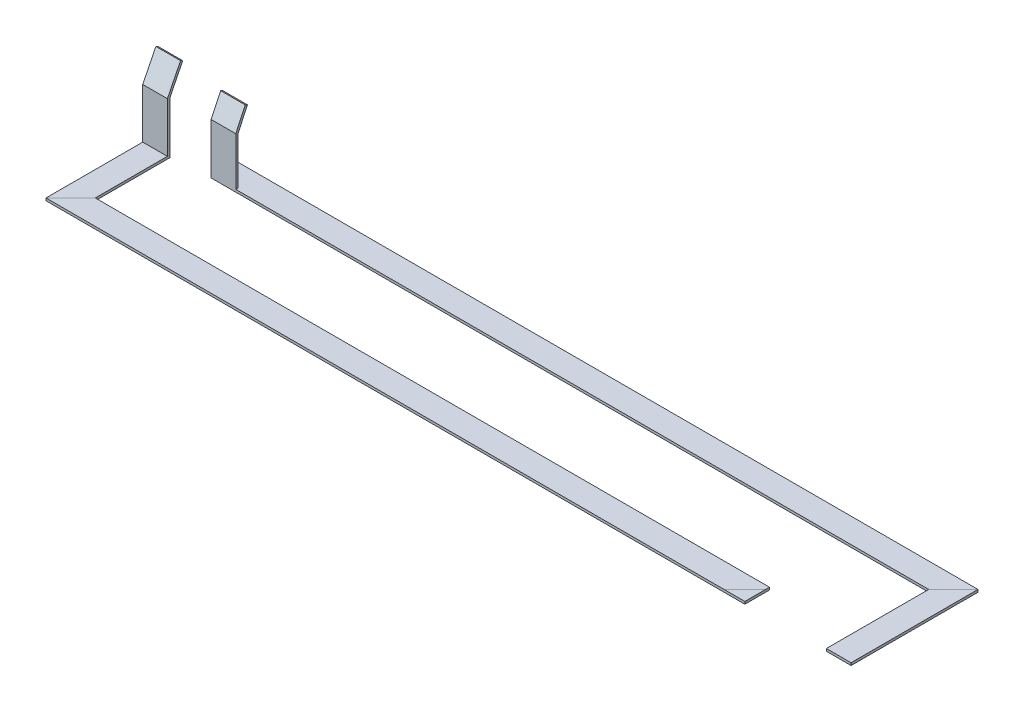
ISO-10303-21;
HEADER;
FILE_DESCRIPTION(('STEP AP214'),'2;1');
FILE_NAME('part.step','',(''),(''),'','','');
FILE_SCHEMA(('AUTOMOTIVE_DESIGN { 1 0 10303 214 1 1 1 1 }'));
ENDSEC;
DATA;
#1=APPLICATION_CONTEXT('core data for automotive mechanical design processes');
#2=APPLICATION_PROTOCOL_DEFINITION('international standard','automotive_design',2000,#1);
#3=PRODUCT_CONTEXT('',#1,'mechanical');
#4=PRODUCT('Part','Part','',(#3));
#5=PRODUCT_RELATED_PRODUCT_CATEGORY('part','',(#4));
#6=PRODUCT_DEFINITION_FORMATION('','',#4);
#7=PRODUCT_DEFINITION_CONTEXT('part definition',#1,'design');
#8=PRODUCT_DEFINITION('design','',#6,#7);
#9=PRODUCT_DEFINITION_SHAPE('','',#8);
#10=(LENGTH_UNIT() NAMED_UNIT(*) SI_UNIT(.MILLI.,.METRE.));
#11=(NAMED_UNIT(*) PLANE_ANGLE_UNIT() SI_UNIT($,.RADIAN.));
#12=(NAMED_UNIT(*) SI_UNIT($,.STERADIAN.) SOLID_ANGLE_UNIT());
#13=UNCERTAINTY_MEASURE_WITH_UNIT(LENGTH_MEASURE(1.E-05),#10,'distance_accuracy_value','');
#14=(GEOMETRIC_REPRESENTATION_CONTEXT(3) GLOBAL_UNCERTAINTY_ASSIGNED_CONTEXT((#13)) GLOBAL_UNIT_ASSIGNED_CONTEXT((#10,
#11,#12)) REPRESENTATION_CONTEXT('',''));
#15=CARTESIAN_POINT('',(0.,0.,0.));
#16=DIRECTION('',(0.,0.,1.));
#17=DIRECTION('',(1.,0.,0.));
#18=AXIS2_PLACEMENT_3D('',#15,#16,#17);
#19=CARTESIAN_POINT('',(2018.45,-570.395,-8.67500000000004));
#20=DIRECTION('',(0.,1.,0.));
#21=DIRECTION('',(0.,0.,1.));
#22=AXIS2_PLACEMENT_3D('',#19,#20,#21);
#23=PLANE('',#22);
#24=DIRECTION('',(0.,0.,1.));
#25=VECTOR('',#24,1.);
#26=CARTESIAN_POINT('',(2081.95,-570.395,-8.67500000000004));
#27=LINE('',#26,#25);
#28=CARTESIAN_POINT('',(2081.95,-570.395,20.9499999999999));
#29=VERTEX_POINT('',#28);
#30=CARTESIAN_POINT('',(2081.95,-570.395,347.95));
#31=VERTEX_POINT('',#30);
#32=EDGE_CURVE('E194',#29,#31,#27,.T.);
#33=ORIENTED_EDGE('',*,*,#32,.T.);
#34=DIRECTION('',(-1.,0.,0.));
#35=VECTOR('',#34,1.);
#36=CARTESIAN_POINT('',(2018.45,-570.395,347.95));
#37=LINE('',#36,#35);
#38=CARTESIAN_POINT('',(2018.45,-570.395,347.95));
#39=VERTEX_POINT('',#38);
#40=EDGE_CURVE('E191',#31,#39,#37,.T.);
#41=ORIENTED_EDGE('',*,*,#40,.T.);
#42=DIRECTION('',(0.,0.,1.));
#43=VECTOR('',#42,1.);
#44=CARTESIAN_POINT('',(2018.45,-570.395,-8.67500000000004));
#45=LINE('',#44,#43);
#46=CARTESIAN_POINT('',(2018.45,-570.395,84.4500000000001));
#47=VERTEX_POINT('',#46);
#48=EDGE_CURVE('E208',#47,#39,#45,.T.);
#49=ORIENTED_EDGE('',*,*,#48,.F.);
#50=DIRECTION('',(0.707106781186548,0.,-0.707106781186548));
#51=VECTOR('',#50,1.);
#52=CARTESIAN_POINT('',(1009.225,-570.395,1093.675));
#53=LINE('',#52,#51);
#54=EDGE_CURVE('E200',#47,#29,#53,.T.);
#55=ORIENTED_EDGE('',*,*,#54,.T.);
#56=EDGE_LOOP('',(#33,#41,#49,#55));
#57=FACE_BOUND('',#56,.T.);
#58=ADVANCED_FACE('F46',(#57),#23,.F.);
#59=CARTESIAN_POINT('',(2081.95,-570.395,-8.67500000000004));
#60=DIRECTION('',(-1.,0.,0.));
#61=DIRECTION('',(0.,0.,1.));
#62=AXIS2_PLACEMENT_3D('',#59,#60,#61);
#63=PLANE('',#62);
#64=DIRECTION('',(0.,0.,1.));
#65=VECTOR('',#64,1.);
#66=CARTESIAN_POINT('',(2081.95,-564.085,-8.67500000000004));
#67=LINE('',#66,#65);
#68=CARTESIAN_POINT('',(2081.95,-564.085,20.95));
#69=VERTEX_POINT('',#68);
#70=CARTESIAN_POINT('',(2081.95,-564.085,347.95));
#71=VERTEX_POINT('',#70);
#72=EDGE_CURVE('E218',#69,#71,#67,.T.);
#73=ORIENTED_EDGE('',*,*,#72,.T.);
#74=DIRECTION('',(0.,1.,0.));
#75=VECTOR('',#74,1.);
#76=CARTESIAN_POINT('',(2081.95,-934.31778313,347.95));
#77=LINE('',#76,#75);
#78=EDGE_CURVE('E184',#31,#71,#77,.T.);
#79=ORIENTED_EDGE('',*,*,#78,.F.);
#80=ORIENTED_EDGE('',*,*,#32,.F.);
#81=DIRECTION('',(0.,1.,0.));
#82=VECTOR('',#81,1.);
#83=CARTESIAN_POINT('',(2081.95,-570.395,20.9499999999999));
#84=LINE('',#83,#82);
#85=EDGE_CURVE('E197',#29,#69,#84,.T.);
#86=ORIENTED_EDGE('',*,*,#85,.T.);
#87=EDGE_LOOP('',(#73,#79,#80,#86));
#88=FACE_BOUND('',#87,.T.);
#89=ADVANCED_FACE('F235',(#88),#63,.F.);
#90=CARTESIAN_POINT('',(2018.45,-564.085,-8.67500000000004));
#91=DIRECTION('',(0.,-1.,0.));
#92=DIRECTION('',(0.,0.,-1.));
#93=AXIS2_PLACEMENT_3D('',#90,#91,#92);
#94=PLANE('',#93);
#95=DIRECTION('',(0.,0.,1.));
#96=VECTOR('',#95,1.);
#97=CARTESIAN_POINT('',(2018.45,-564.085,-8.67500000000004));
#98=LINE('',#97,#96);
#99=CARTESIAN_POINT('',(2018.45,-564.085,84.4500000000001));
#100=VERTEX_POINT('',#99);
#101=CARTESIAN_POINT('',(2018.45,-564.085,347.95));
#102=VERTEX_POINT('',#101);
#103=EDGE_CURVE('E221',#100,#102,#98,.T.);
#104=ORIENTED_EDGE('',*,*,#103,.T.);
#105=DIRECTION('',(1.,0.,0.));
#106=VECTOR('',#105,1.);
#107=CARTESIAN_POINT('',(2018.45,-564.085,347.95));
#108=LINE('',#107,#106);
#109=EDGE_CURVE('E188',#102,#71,#108,.T.);
#110=ORIENTED_EDGE('',*,*,#109,.T.);
#111=ORIENTED_EDGE('',*,*,#72,.F.);
#112=DIRECTION('',(-0.707106781186548,0.,0.707106781186548));
#113=VECTOR('',#112,1.);
#114=CARTESIAN_POINT('',(1009.225,-564.085,1093.675));
#115=LINE('',#114,#113);
#116=EDGE_CURVE('E53',#69,#100,#115,.T.);
#117=ORIENTED_EDGE('',*,*,#116,.T.);
#118=EDGE_LOOP('',(#104,#110,#111,#117));
#119=FACE_BOUND('',#118,.T.);
#120=ADVANCED_FACE('F238',(#119),#94,.F.);
#121=CARTESIAN_POINT('',(2018.45,-570.395,-8.67500000000004));
#122=DIRECTION('',(1.,0.,0.));
#123=DIRECTION('',(0.,0.,-1.));
#124=AXIS2_PLACEMENT_3D('',#121,#122,#123);
#125=PLANE('',#124);
#126=ORIENTED_EDGE('',*,*,#48,.T.);
#127=DIRECTION('',(0.,1.,0.));
#128=VECTOR('',#127,1.);
#129=CARTESIAN_POINT('',(2018.45,-570.395,347.95));
#130=LINE('',#129,#128);
#131=EDGE_CURVE('E12',#39,#102,#130,.T.);
#132=ORIENTED_EDGE('',*,*,#131,.T.);
#133=ORIENTED_EDGE('',*,*,#103,.F.);
#134=DIRECTION('',(0.,-1.,0.));
#135=VECTOR('',#134,1.);
#136=CARTESIAN_POINT('',(2018.45,-570.395,84.4499999999999));
#137=LINE('',#136,#135);
#138=EDGE_CURVE('E203',#100,#47,#137,.T.);
#139=ORIENTED_EDGE('',*,*,#138,.T.);
#140=EDGE_LOOP('',(#126,#132,#133,#139));
#141=FACE_BOUND('',#140,.T.);
#142=ADVANCED_FACE('F226',(#141),#125,.F.);
#143=CARTESIAN_POINT('',(0.,-570.395,84.4499999999999));
#144=DIRECTION('',(0.,1.,0.));
#145=DIRECTION('',(0.,0.,1.));
#146=AXIS2_PLACEMENT_3D('',#143,#144,#145);
#147=PLANE('',#146);
#148=DIRECTION('',(1.,0.,0.));
#149=VECTOR('',#148,1.);
#150=CARTESIAN_POINT('',(0.,-570.395,84.4499999999999));
#151=LINE('',#150,#149);
#152=CARTESIAN_POINT('',(170.25,-570.395,84.4499999999999));
#153=VERTEX_POINT('',#152);
#154=EDGE_CURVE('E212',#153,#47,#151,.T.);
#155=ORIENTED_EDGE('',*,*,#154,.F.);
#156=DIRECTION('',(0.,0.,1.));
#157=VECTOR('',#156,1.);
#158=CARTESIAN_POINT('',(170.25,-570.395,20.95));
#159=LINE('',#158,#157);
#160=CARTESIAN_POINT('',(170.25,-570.395,20.95));
#161=VERTEX_POINT('',#160);
#162=EDGE_CURVE('E177',#161,#153,#159,.T.);
#163=ORIENTED_EDGE('',*,*,#162,.F.);
#164=DIRECTION('',(1.,0.,0.));
#165=VECTOR('',#164,1.);
#166=CARTESIAN_POINT('',(0.,-570.395,20.9499999999999));
#167=LINE('',#166,#165);
#168=EDGE_CURVE('E204',#161,#29,#167,.T.);
#169=ORIENTED_EDGE('',*,*,#168,.T.);
#170=ORIENTED_EDGE('',*,*,#54,.F.);
#171=EDGE_LOOP('',(#155,#163,#169,#170));
#172=FACE_BOUND('',#171,.T.);
#173=ADVANCED_FACE('F242',(#172),#147,.F.);
#174=CARTESIAN_POINT('',(0.,-570.395,20.9499999999999));
#175=DIRECTION('',(0.,0.,1.));
#176=DIRECTION('',(0.,-1.,0.));
#177=AXIS2_PLACEMENT_3D('',#174,#175,#176);
#178=PLANE('',#177);
#179=ORIENTED_EDGE('',*,*,#168,.F.);
#180=DIRECTION('',(0.,1.,0.));
#181=VECTOR('',#180,1.);
#182=CARTESIAN_POINT('',(170.25,-570.395,20.95));
#183=LINE('',#182,#181);
#184=CARTESIAN_POINT('',(170.25,-564.085,20.95));
#185=VERTEX_POINT('',#184);
#186=EDGE_CURVE('E180',#161,#185,#183,.T.);
#187=ORIENTED_EDGE('',*,*,#186,.T.);
#188=DIRECTION('',(1.,0.,0.));
#189=VECTOR('',#188,1.);
#190=CARTESIAN_POINT('',(0.,-564.085,20.9499999999999));
#191=LINE('',#190,#189);
#192=EDGE_CURVE('E207',#185,#69,#191,.T.);
#193=ORIENTED_EDGE('',*,*,#192,.T.);
#194=ORIENTED_EDGE('',*,*,#85,.F.);
#195=EDGE_LOOP('',(#179,#187,#193,#194));
#196=FACE_BOUND('',#195,.T.);
#197=ADVANCED_FACE('F245',(#196),#178,.F.);
#198=CARTESIAN_POINT('',(0.,-564.085,84.4499999999999));
#199=DIRECTION('',(0.,-1.,0.));
#200=DIRECTION('',(0.,0.,-1.));
#201=AXIS2_PLACEMENT_3D('',#198,#199,#200);
#202=PLANE('',#201);
#203=DIRECTION('',(0.,0.,1.));
#204=VECTOR('',#203,1.);
#205=CARTESIAN_POINT('',(170.25,-564.085,20.95));
#206=LINE('',#205,#204);
#207=CARTESIAN_POINT('',(170.25,-564.085,78.14));
#208=VERTEX_POINT('',#207);
#209=EDGE_CURVE('E171',#185,#208,#206,.T.);
#210=ORIENTED_EDGE('',*,*,#209,.T.);
#211=DIRECTION('',(-1.,0.,0.));
#212=VECTOR('',#211,1.);
#213=CARTESIAN_POINT('',(233.75,-564.085,78.14));
#214=LINE('',#213,#212);
#215=CARTESIAN_POINT('',(233.75,-564.085,78.14));
#216=VERTEX_POINT('',#215);
#217=EDGE_CURVE('E60',#216,#208,#214,.T.);
#218=ORIENTED_EDGE('',*,*,#217,.F.);
#219=DIRECTION('',(0.,0.,1.));
#220=VECTOR('',#219,1.);
#221=CARTESIAN_POINT('',(233.75,-564.085,78.14));
#222=LINE('',#221,#220);
#223=CARTESIAN_POINT('',(233.75,-564.085,84.4499999999999));
#224=VERTEX_POINT('',#223);
#225=EDGE_CURVE('E64',#216,#224,#222,.T.);
#226=ORIENTED_EDGE('',*,*,#225,.T.);
#227=DIRECTION('',(1.,0.,0.));
#228=VECTOR('',#227,1.);
#229=CARTESIAN_POINT('',(0.,-564.085,84.4499999999999));
#230=LINE('',#229,#228);
#231=EDGE_CURVE('E150',#224,#100,#230,.T.);
#232=ORIENTED_EDGE('',*,*,#231,.T.);
#233=ORIENTED_EDGE('',*,*,#116,.F.);
#234=ORIENTED_EDGE('',*,*,#192,.F.);
#235=EDGE_LOOP('',(#210,#218,#226,#232,#233,#234));
#236=FACE_BOUND('',#235,.T.);
#237=ADVANCED_FACE('F239',(#236),#202,.F.);
#238=CARTESIAN_POINT('',(0.,-570.395,84.4499999999999));
#239=DIRECTION('',(0.,0.,-1.));
#240=DIRECTION('',(0.,1.,0.));
#241=AXIS2_PLACEMENT_3D('',#238,#239,#240);
#242=PLANE('',#241);
#243=ORIENTED_EDGE('',*,*,#231,.F.);
#244=DIRECTION('',(0.,1.,0.));
#245=VECTOR('',#244,1.);
#246=CARTESIAN_POINT('',(233.75,-564.085,84.4499999999999));
#247=LINE('',#246,#245);
#248=CARTESIAN_POINT('',(233.75,-439.884522325931,84.4499999999999));
#249=VERTEX_POINT('',#248);
#250=EDGE_CURVE('E143',#224,#249,#247,.T.);
#251=ORIENTED_EDGE('',*,*,#250,.T.);
#252=DIRECTION('',(-1.,0.,0.));
#253=VECTOR('',#252,1.);
#254=CARTESIAN_POINT('',(233.75,-439.884522325931,84.4499999999999));
#255=LINE('',#254,#253);
#256=CARTESIAN_POINT('',(170.25,-439.884522325931,84.4499999999999));
#257=VERTEX_POINT('',#256);
#258=EDGE_CURVE('E127',#249,#257,#255,.T.);
#259=ORIENTED_EDGE('',*,*,#258,.T.);
#260=DIRECTION('',(0.,1.,0.));
#261=VECTOR('',#260,1.);
#262=CARTESIAN_POINT('',(170.25,-570.395,84.4499999999999));
#263=LINE('',#262,#261);
#264=EDGE_CURVE('E182',#153,#257,#263,.T.);
#265=ORIENTED_EDGE('',*,*,#264,.F.);
#266=ORIENTED_EDGE('',*,*,#154,.T.);
#267=ORIENTED_EDGE('',*,*,#138,.F.);
#268=EDGE_LOOP('',(#243,#251,#259,#265,#266,#267));
#269=FACE_BOUND('',#268,.T.);
#270=ADVANCED_FACE('F148',(#269),#242,.F.);
#271=CARTESIAN_POINT('',(1754.95,-934.31778313,347.95));
#272=DIRECTION('',(0.,0.,-1.));
#273=DIRECTION('',(-1.,0.,0.));
#274=AXIS2_PLACEMENT_3D('',#271,#272,#273);
#275=PLANE('',#274);
#276=ORIENTED_EDGE('',*,*,#78,.T.);
#277=ORIENTED_EDGE('',*,*,#109,.F.);
#278=ORIENTED_EDGE('',*,*,#131,.F.);
#279=ORIENTED_EDGE('',*,*,#40,.F.);
#280=EDGE_LOOP('',(#276,#277,#278,#279));
#281=FACE_BOUND('',#280,.T.);
#282=ADVANCED_FACE('F233',(#281),#275,.F.);
#283=CARTESIAN_POINT('',(170.25,-570.395,20.95));
#284=DIRECTION('',(-1.,0.,0.));
#285=DIRECTION('',(0.,0.,1.));
#286=AXIS2_PLACEMENT_3D('',#283,#284,#285);
#287=PLANE('',#286);
#288=ORIENTED_EDGE('',*,*,#209,.F.);
#289=ORIENTED_EDGE('',*,*,#186,.F.);
#290=ORIENTED_EDGE('',*,*,#162,.T.);
#291=ORIENTED_EDGE('',*,*,#264,.T.);
#292=DIRECTION('',(0.,0.90459963896107,-0.426262235239648));
#293=VECTOR('',#292,1.);
#294=CARTESIAN_POINT('',(170.25,-439.884522325931,84.4499999999999));
#295=LINE('',#294,#293);
#296=CARTESIAN_POINT('',(170.25,-387.92551527643,59.9660608828121));
#297=VERTEX_POINT('',#296);
#298=EDGE_CURVE('E132',#257,#297,#295,.T.);
#299=ORIENTED_EDGE('',*,*,#298,.T.);
#300=DIRECTION('',(0.,-0.426262235239649,-0.90459963896107));
#301=VECTOR('',#300,1.);
#302=CARTESIAN_POINT('',(170.25,-387.92551527643,59.9660608828121));
#303=LINE('',#302,#301);
#304=CARTESIAN_POINT('',(170.25,-390.615229980792,54.2580371609677));
#305=VERTEX_POINT('',#304);
#306=EDGE_CURVE('E162',#297,#305,#303,.T.);
#307=ORIENTED_EDGE('',*,*,#306,.T.);
#308=DIRECTION('',(0.,-0.90459963896107,0.426262235239649));
#309=VECTOR('',#308,1.);
#310=CARTESIAN_POINT('',(170.25,-390.615229980792,54.2580371609677));
#311=LINE('',#310,#309);
#312=CARTESIAN_POINT('',(170.25,-441.296742852146,78.1399999999999));
#313=VERTEX_POINT('',#312);
#314=EDGE_CURVE('E165',#305,#313,#311,.T.);
#315=ORIENTED_EDGE('',*,*,#314,.T.);
#316=DIRECTION('',(0.,-1.,0.));
#317=VECTOR('',#316,1.);
#318=CARTESIAN_POINT('',(170.25,-441.296742852146,78.1399999999999));
#319=LINE('',#318,#317);
#320=EDGE_CURVE('E152',#313,#208,#319,.T.);
#321=ORIENTED_EDGE('',*,*,#320,.T.);
#322=EDGE_LOOP('',(#288,#289,#290,#291,#299,#307,#315,#321));
#323=FACE_BOUND('',#322,.T.);
#324=ADVANCED_FACE('F248',(#323),#287,.T.);
#325=CARTESIAN_POINT('',(233.75,-441.296742852146,78.1399999999999));
#326=DIRECTION('',(0.,0.,-1.));
#327=DIRECTION('',(0.,1.,0.));
#328=AXIS2_PLACEMENT_3D('',#325,#326,#327);
#329=PLANE('',#328);
#330=ORIENTED_EDGE('',*,*,#320,.F.);
#331=DIRECTION('',(-1.,0.,0.));
#332=VECTOR('',#331,1.);
#333=CARTESIAN_POINT('',(233.75,-441.296742852146,78.1399999999999));
#334=LINE('',#333,#332);
#335=CARTESIAN_POINT('',(233.75,-441.296742852146,78.1399999999999));
#336=VERTEX_POINT('',#335);
#337=EDGE_CURVE('E172',#336,#313,#334,.T.);
#338=ORIENTED_EDGE('',*,*,#337,.F.);
#339=DIRECTION('',(0.,-1.,0.));
#340=VECTOR('',#339,1.);
#341=CARTESIAN_POINT('',(233.75,-441.296742852146,78.1399999999999));
#342=LINE('',#341,#340);
#343=EDGE_CURVE('E137',#336,#216,#342,.T.);
#344=ORIENTED_EDGE('',*,*,#343,.T.);
#345=ORIENTED_EDGE('',*,*,#217,.T.);
#346=EDGE_LOOP('',(#330,#338,#344,#345));
#347=FACE_BOUND('',#346,.T.);
#348=ADVANCED_FACE('F251',(#347),#329,.T.);
#349=CARTESIAN_POINT('',(233.75,-390.615229980792,54.2580371609677));
#350=DIRECTION('',(0.,-0.426262235239649,-0.90459963896107));
#351=DIRECTION('',(0.,0.90459963896107,-0.426262235239649));
#352=AXIS2_PLACEMENT_3D('',#349,#350,#351);
#353=PLANE('',#352);
#354=ORIENTED_EDGE('',*,*,#314,.F.);
#355=DIRECTION('',(-1.,0.,0.));
#356=VECTOR('',#355,1.);
#357=CARTESIAN_POINT('',(233.75,-390.615229980792,54.2580371609677));
#358=LINE('',#357,#356);
#359=CARTESIAN_POINT('',(233.75,-390.615229980792,54.2580371609677));
#360=VERTEX_POINT('',#359);
#361=EDGE_CURVE('E174',#360,#305,#358,.T.);
#362=ORIENTED_EDGE('',*,*,#361,.F.);
#363=DIRECTION('',(0.,-0.90459963896107,0.426262235239649));
#364=VECTOR('',#363,1.);
#365=CARTESIAN_POINT('',(233.75,-390.615229980792,54.2580371609677));
#366=LINE('',#365,#364);
#367=EDGE_CURVE('E156',#360,#336,#366,.T.);
#368=ORIENTED_EDGE('',*,*,#367,.T.);
#369=ORIENTED_EDGE('',*,*,#337,.T.);
#370=EDGE_LOOP('',(#354,#362,#368,#369));
#371=FACE_BOUND('',#370,.T.);
#372=ADVANCED_FACE('F258',(#371),#353,.T.);
#373=CARTESIAN_POINT('',(233.75,-387.92551527643,59.9660608828121));
#374=DIRECTION('',(0.,0.90459963896107,-0.426262235239649));
#375=DIRECTION('',(0.,0.426262235239649,0.90459963896107));
#376=AXIS2_PLACEMENT_3D('',#373,#374,#375);
#377=PLANE('',#376);
#378=ORIENTED_EDGE('',*,*,#306,.F.);
#379=DIRECTION('',(-1.,0.,0.));
#380=VECTOR('',#379,1.);
#381=CARTESIAN_POINT('',(233.75,-387.92551527643,59.9660608828121));
#382=LINE('',#381,#380);
#383=CARTESIAN_POINT('',(233.75,-387.92551527643,59.9660608828121));
#384=VERTEX_POINT('',#383);
#385=EDGE_CURVE('E136',#384,#297,#382,.T.);
#386=ORIENTED_EDGE('',*,*,#385,.F.);
#387=DIRECTION('',(0.,-0.426262235239649,-0.90459963896107));
#388=VECTOR('',#387,1.);
#389=CARTESIAN_POINT('',(233.75,-387.92551527643,59.9660608828121));
#390=LINE('',#389,#388);
#391=EDGE_CURVE('E146',#384,#360,#390,.T.);
#392=ORIENTED_EDGE('',*,*,#391,.T.);
#393=ORIENTED_EDGE('',*,*,#361,.T.);
#394=EDGE_LOOP('',(#378,#386,#392,#393));
#395=FACE_BOUND('',#394,.T.);
#396=ADVANCED_FACE('F256',(#395),#377,.T.);
#397=CARTESIAN_POINT('',(233.75,-439.884522325931,84.4499999999999));
#398=DIRECTION('',(0.,0.426262235239648,0.90459963896107));
#399=DIRECTION('',(0.,-0.90459963896107,0.426262235239648));
#400=AXIS2_PLACEMENT_3D('',#397,#398,#399);
#401=PLANE('',#400);
#402=ORIENTED_EDGE('',*,*,#298,.F.);
#403=ORIENTED_EDGE('',*,*,#258,.F.);
#404=DIRECTION('',(0.,0.90459963896107,-0.426262235239648));
#405=VECTOR('',#404,1.);
#406=CARTESIAN_POINT('',(233.75,-439.884522325931,84.4499999999999));
#407=LINE('',#406,#405);
#408=EDGE_CURVE('E130',#249,#384,#407,.T.);
#409=ORIENTED_EDGE('',*,*,#408,.T.);
#410=ORIENTED_EDGE('',*,*,#385,.T.);
#411=EDGE_LOOP('',(#402,#403,#409,#410));
#412=FACE_BOUND('',#411,.T.);
#413=ADVANCED_FACE('F129',(#412),#401,.T.);
#414=CARTESIAN_POINT('',(233.75,0.,0.));
#415=DIRECTION('',(-1.,0.,0.));
#416=DIRECTION('',(0.,0.,1.));
#417=AXIS2_PLACEMENT_3D('',#414,#415,#416);
#418=PLANE('',#417);
#419=ORIENTED_EDGE('',*,*,#225,.F.);
#420=ORIENTED_EDGE('',*,*,#343,.F.);
#421=ORIENTED_EDGE('',*,*,#367,.F.);
#422=ORIENTED_EDGE('',*,*,#391,.F.);
#423=ORIENTED_EDGE('',*,*,#408,.F.);
#424=ORIENTED_EDGE('',*,*,#250,.F.);
#425=EDGE_LOOP('',(#419,#420,#421,#422,#423,#424));
#426=FACE_BOUND('',#425,.T.);
#427=ADVANCED_FACE('F142',(#426),#418,.F.);
#428=CLOSED_SHELL('',(#58,#89,#120,#142,#173,#197,#237,#270,#282,#324,#348,#372,#396,#413,#427));
#429=MANIFOLD_SOLID_BREP('B2',#428);
#430=CARTESIAN_POINT('',(1754.95,-570.395,281.175));
#431=DIRECTION('',(0.,1.,0.));
#432=DIRECTION('',(0.,0.,1.));
#433=AXIS2_PLACEMENT_3D('',#430,#431,#432);
#434=PLANE('',#433);
#435=DIRECTION('',(0.707106781186548,0.,-0.707106781186548));
#436=VECTOR('',#435,1.);
#437=CARTESIAN_POINT('',(859.9625,-570.395,1242.9375));
#438=LINE('',#437,#436);
#439=CARTESIAN_POINT('',(1754.95,-570.395,347.95));
#440=VERTEX_POINT('',#439);
#441=CARTESIAN_POINT('',(1808.45,-570.395,294.45));
#442=VERTEX_POINT('',#441);
#443=EDGE_CURVE('E527',#440,#442,#438,.T.);
#444=ORIENTED_EDGE('',*,*,#443,.T.);
#445=DIRECTION('',(0.,0.,1.));
#446=VECTOR('',#445,1.);
#447=CARTESIAN_POINT('',(1808.45,-570.395,281.175));
#448=LINE('',#447,#446);
#449=CARTESIAN_POINT('',(1808.45,-570.395,347.95));
#450=VERTEX_POINT('',#449);
#451=EDGE_CURVE('E609',#442,#450,#448,.T.);
#452=ORIENTED_EDGE('',*,*,#451,.T.);
#453=DIRECTION('',(-1.,0.,0.));
#454=VECTOR('',#453,1.);
#455=CARTESIAN_POINT('',(1754.95,-570.395,347.95));
#456=LINE('',#455,#454);
#457=EDGE_CURVE('E523',#450,#440,#456,.T.);
#458=ORIENTED_EDGE('',*,*,#457,.T.);
#459=EDGE_LOOP('',(#444,#452,#458));
#460=FACE_BOUND('',#459,.T.);
#461=ADVANCED_FACE('F405',(#460),#434,.F.);
#462=CARTESIAN_POINT('',(1754.95,-564.085,281.175));
#463=DIRECTION('',(0.,-1.,0.));
#464=DIRECTION('',(0.,0.,-1.));
#465=AXIS2_PLACEMENT_3D('',#462,#463,#464);
#466=PLANE('',#465);
#467=DIRECTION('',(1.,0.,0.));
#468=VECTOR('',#467,1.);
#469=CARTESIAN_POINT('',(1754.95,-564.085,347.95));
#470=LINE('',#469,#468);
#471=CARTESIAN_POINT('',(1754.95,-564.085,347.95));
#472=VERTEX_POINT('',#471);
#473=CARTESIAN_POINT('',(1808.45,-564.085,347.95));
#474=VERTEX_POINT('',#473);
#475=EDGE_CURVE('E538',#472,#474,#470,.T.);
#476=ORIENTED_EDGE('',*,*,#475,.T.);
#477=DIRECTION('',(0.,0.,1.));
#478=VECTOR('',#477,1.);
#479=CARTESIAN_POINT('',(1808.45,-564.085,284.45));
#480=LINE('',#479,#478);
#481=CARTESIAN_POINT('',(1808.45,-564.085,294.45));
#482=VERTEX_POINT('',#481);
#483=EDGE_CURVE('E419',#482,#474,#480,.T.);
#484=ORIENTED_EDGE('',*,*,#483,.F.);
#485=DIRECTION('',(-0.707106781186548,0.,0.707106781186548));
#486=VECTOR('',#485,1.);
#487=CARTESIAN_POINT('',(859.9625,-564.085,1242.9375));
#488=LINE('',#487,#486);
#489=EDGE_CURVE('E412',#482,#472,#488,.T.);
#490=ORIENTED_EDGE('',*,*,#489,.T.);
#491=EDGE_LOOP('',(#476,#484,#490));
#492=FACE_BOUND('',#491,.T.);
#493=ADVANCED_FACE('F651',(#492),#466,.F.);
#494=CARTESIAN_POINT('',(-35.0249999999999,-570.395,347.95));
#495=DIRECTION('',(0.,1.,0.));
#496=DIRECTION('',(0.,0.,1.));
#497=AXIS2_PLACEMENT_3D('',#494,#495,#496);
#498=PLANE('',#497);
#499=DIRECTION('',(1.,0.,0.));
#500=VECTOR('',#499,1.);
#501=CARTESIAN_POINT('',(-35.0249999999999,-570.395,284.45));
#502=LINE('',#501,#500);
#503=CARTESIAN_POINT('',(71.95,-570.395,284.45));
#504=VERTEX_POINT('',#503);
#505=CARTESIAN_POINT('',(1808.45,-570.395,284.45));
#506=VERTEX_POINT('',#505);
#507=EDGE_CURVE('E519',#504,#506,#502,.T.);
#508=ORIENTED_EDGE('',*,*,#507,.T.);
#509=DIRECTION('',(0.,0.,1.));
#510=VECTOR('',#509,1.);
#511=CARTESIAN_POINT('',(1808.45,-570.395,347.95));
#512=LINE('',#511,#510);
#513=EDGE_CURVE('E501',#506,#442,#512,.T.);
#514=ORIENTED_EDGE('',*,*,#513,.T.);
#515=ORIENTED_EDGE('',*,*,#443,.F.);
#516=DIRECTION('',(1.,0.,0.));
#517=VECTOR('',#516,1.);
#518=CARTESIAN_POINT('',(-35.0249999999999,-570.395,347.95));
#519=LINE('',#518,#517);
#520=CARTESIAN_POINT('',(8.45000000000002,-570.395,347.95));
#521=VERTEX_POINT('',#520);
#522=EDGE_CURVE('E521',#521,#440,#519,.T.);
#523=ORIENTED_EDGE('',*,*,#522,.F.);
#524=DIRECTION('',(0.707106781186548,0.,-0.707106781186548));
#525=VECTOR('',#524,1.);
#526=CARTESIAN_POINT('',(80.1,-570.395,276.3));
#527=LINE('',#526,#525);
#528=EDGE_CURVE('E558',#521,#504,#527,.T.);
#529=ORIENTED_EDGE('',*,*,#528,.T.);
#530=EDGE_LOOP('',(#508,#514,#515,#523,#529));
#531=FACE_BOUND('',#530,.T.);
#532=ADVANCED_FACE('F613',(#531),#498,.F.);
#533=CARTESIAN_POINT('',(-35.0249999999999,-570.395,284.45));
#534=DIRECTION('',(0.,0.,1.));
#535=DIRECTION('',(0.,-1.,0.));
#536=AXIS2_PLACEMENT_3D('',#533,#534,#535);
#537=PLANE('',#536);
#538=DIRECTION('',(1.,0.,0.));
#539=VECTOR('',#538,1.);
#540=CARTESIAN_POINT('',(-35.0249999999999,-564.085,284.45));
#541=LINE('',#540,#539);
#542=CARTESIAN_POINT('',(71.95,-564.085,284.45));
#543=VERTEX_POINT('',#542);
#544=CARTESIAN_POINT('',(1808.45,-564.085,284.45));
#545=VERTEX_POINT('',#544);
#546=EDGE_CURVE('E510',#543,#545,#541,.T.);
#547=ORIENTED_EDGE('',*,*,#546,.T.);
#548=DIRECTION('',(0.,1.,0.));
#549=VECTOR('',#548,1.);
#550=CARTESIAN_POINT('',(1808.45,-617.085,284.45));
#551=LINE('',#550,#549);
#552=EDGE_CURVE('E496',#506,#545,#551,.T.);
#553=ORIENTED_EDGE('',*,*,#552,.F.);
#554=ORIENTED_EDGE('',*,*,#507,.F.);
#555=DIRECTION('',(0.,1.,0.));
#556=VECTOR('',#555,1.);
#557=CARTESIAN_POINT('',(71.95,-564.085,284.45));
#558=LINE('',#557,#556);
#559=EDGE_CURVE('E517',#504,#543,#558,.T.);
#560=ORIENTED_EDGE('',*,*,#559,.T.);
#561=EDGE_LOOP('',(#547,#553,#554,#560));
#562=FACE_BOUND('',#561,.T.);
#563=ADVANCED_FACE('F515',(#562),#537,.F.);
#564=CARTESIAN_POINT('',(-35.0249999999999,-564.085,347.95));
#565=DIRECTION('',(0.,-1.,0.));
#566=DIRECTION('',(0.,0.,-1.));
#567=AXIS2_PLACEMENT_3D('',#564,#565,#566);
#568=PLANE('',#567);
#569=ORIENTED_EDGE('',*,*,#489,.F.);
#570=EDGE_CURVE('E499',#545,#482,#480,.T.);
#571=ORIENTED_EDGE('',*,*,#570,.F.);
#572=ORIENTED_EDGE('',*,*,#546,.F.);
#573=DIRECTION('',(-0.707106781186548,0.,0.707106781186548));
#574=VECTOR('',#573,1.);
#575=CARTESIAN_POINT('',(48.35,-564.085,308.05));
#576=LINE('',#575,#574);
#577=CARTESIAN_POINT('',(8.44999999999996,-564.085,347.95));
#578=VERTEX_POINT('',#577);
#579=EDGE_CURVE('E544',#543,#578,#576,.T.);
#580=ORIENTED_EDGE('',*,*,#579,.T.);
#581=DIRECTION('',(1.,0.,0.));
#582=VECTOR('',#581,1.);
#583=CARTESIAN_POINT('',(-35.0249999999999,-564.085,347.95));
#584=LINE('',#583,#582);
#585=EDGE_CURVE('E518',#578,#472,#584,.T.);
#586=ORIENTED_EDGE('',*,*,#585,.T.);
#587=EDGE_LOOP('',(#569,#571,#572,#580,#586));
#588=FACE_BOUND('',#587,.T.);
#589=ADVANCED_FACE('F508',(#588),#568,.F.);
#590=CARTESIAN_POINT('',(-35.0249999999999,-570.395,347.95));
#591=DIRECTION('',(0.,0.,-1.));
#592=DIRECTION('',(0.,1.,0.));
#593=AXIS2_PLACEMENT_3D('',#590,#591,#592);
#594=PLANE('',#593);
#595=ORIENTED_EDGE('',*,*,#457,.F.);
#596=DIRECTION('',(0.,1.,0.));
#597=VECTOR('',#596,1.);
#598=CARTESIAN_POINT('',(1808.45,-570.395,347.95));
#599=LINE('',#598,#597);
#600=EDGE_CURVE('E44',#450,#474,#599,.T.);
#601=ORIENTED_EDGE('',*,*,#600,.T.);
#602=ORIENTED_EDGE('',*,*,#475,.F.);
#603=ORIENTED_EDGE('',*,*,#585,.F.);
#604=DIRECTION('',(0.,-1.,0.));
#605=VECTOR('',#604,1.);
#606=CARTESIAN_POINT('',(8.45000000000003,-570.395000000001,347.95));
#607=LINE('',#606,#605);
#608=EDGE_CURVE('E556',#578,#521,#607,.T.);
#609=ORIENTED_EDGE('',*,*,#608,.T.);
#610=ORIENTED_EDGE('',*,*,#522,.T.);
#611=EDGE_LOOP('',(#595,#601,#602,#603,#609,#610));
#612=FACE_BOUND('',#611,.T.);
#613=ADVANCED_FACE('F648',(#612),#594,.F.);
#614=CARTESIAN_POINT('',(8.44999999999996,-564.085,351.225));
#615=DIRECTION('',(0.,1.,0.));
#616=DIRECTION('',(0.,0.,1.));
#617=AXIS2_PLACEMENT_3D('',#614,#615,#616);
#618=PLANE('',#617);
#619=DIRECTION('',(-1.,0.,0.));
#620=VECTOR('',#619,1.);
#621=CARTESIAN_POINT('',(71.95,-564.084999999999,98.7872047927987));
#622=LINE('',#621,#620);
#623=CARTESIAN_POINT('',(71.95,-564.084999999999,98.7872047927987));
#624=VERTEX_POINT('',#623);
#625=CARTESIAN_POINT('',(8.44999999999996,-564.085,98.7872047927987));
#626=VERTEX_POINT('',#625);
#627=EDGE_CURVE('E562',#624,#626,#622,.T.);
#628=ORIENTED_EDGE('',*,*,#627,.T.);
#629=DIRECTION('',(0.,0.,-1.));
#630=VECTOR('',#629,1.);
#631=CARTESIAN_POINT('',(8.44999999999996,-564.085,351.225));
#632=LINE('',#631,#630);
#633=EDGE_CURVE('E541',#578,#626,#632,.T.);
#634=ORIENTED_EDGE('',*,*,#633,.F.);
#635=ORIENTED_EDGE('',*,*,#579,.F.);
#636=DIRECTION('',(0.,0.,-1.));
#637=VECTOR('',#636,1.);
#638=CARTESIAN_POINT('',(71.95,-564.085,351.225));
#639=LINE('',#638,#637);
#640=EDGE_CURVE('E545',#543,#624,#639,.T.);
#641=ORIENTED_EDGE('',*,*,#640,.T.);
#642=EDGE_LOOP('',(#628,#634,#635,#641));
#643=FACE_BOUND('',#642,.T.);
#644=ADVANCED_FACE('F647',(#643),#618,.T.);
#645=CARTESIAN_POINT('',(71.95,-564.085,351.225));
#646=DIRECTION('',(1.,0.,0.));
#647=DIRECTION('',(0.,1.,0.));
#648=AXIS2_PLACEMENT_3D('',#645,#646,#647);
#649=PLANE('',#648);
#650=DIRECTION('',(0.,1.,0.));
#651=VECTOR('',#650,1.);
#652=CARTESIAN_POINT('',(71.95,-627.585,91.8429329999988));
#653=LINE('',#652,#651);
#654=CARTESIAN_POINT('',(71.95,-570.395,91.8429329999988));
#655=VERTEX_POINT('',#654);
#656=CARTESIAN_POINT('',(71.95,-564.085,91.8429329999988));
#657=VERTEX_POINT('',#656);
#658=EDGE_CURVE('E606',#655,#657,#653,.T.);
#659=ORIENTED_EDGE('',*,*,#658,.T.);
#660=DIRECTION('',(0.,-0.999999909323526,-0.000425855537530923));
#661=VECTOR('',#660,1.);
#662=CARTESIAN_POINT('',(71.9499999999988,-435.843461778527,91.8975453741439));
#663=LINE('',#662,#661);
#664=CARTESIAN_POINT('',(71.9499999999988,-435.843461778527,91.8975453741439));
#665=VERTEX_POINT('',#664);
#666=EDGE_CURVE('E566',#665,#657,#663,.T.);
#667=ORIENTED_EDGE('',*,*,#666,.F.);
#668=DIRECTION('',(0.,-0.895126869580738,0.445811493071442));
#669=VECTOR('',#668,1.);
#670=CARTESIAN_POINT('',(71.9499999999983,-370.435814977783,59.3217377769626));
#671=LINE('',#670,#669);
#672=CARTESIAN_POINT('',(71.9499999999983,-370.435814977783,59.3217377769626));
#673=VERTEX_POINT('',#672);
#674=EDGE_CURVE('E594',#673,#665,#671,.T.);
#675=ORIENTED_EDGE('',*,*,#674,.F.);
#676=DIRECTION('',(0.,-0.445811493071446,-0.895126869580736));
#677=VECTOR('',#676,1.);
#678=CARTESIAN_POINT('',(71.9499999999982,-367.622744456502,64.969988324017));
#679=LINE('',#678,#677);
#680=CARTESIAN_POINT('',(71.9499999999982,-367.622744456502,64.969988324017));
#681=VERTEX_POINT('',#680);
#682=EDGE_CURVE('E597',#681,#673,#679,.T.);
#683=ORIENTED_EDGE('',*,*,#682,.F.);
#684=DIRECTION('',(0.,0.895126869580738,-0.445811493071442));
#685=VECTOR('',#684,1.);
#686=CARTESIAN_POINT('',(71.9499999999988,-435.522965931465,98.7872047927987));
#687=LINE('',#686,#685);
#688=CARTESIAN_POINT('',(71.9499999999988,-435.522965931465,98.7872047927987));
#689=VERTEX_POINT('',#688);
#690=EDGE_CURVE('E600',#689,#681,#687,.T.);
#691=ORIENTED_EDGE('',*,*,#690,.F.);
#692=DIRECTION('',(0.,1.,0.));
#693=VECTOR('',#692,1.);
#694=CARTESIAN_POINT('',(71.95,-564.084999999999,98.7872047927987));
#695=LINE('',#694,#693);
#696=EDGE_CURVE('E578',#624,#689,#695,.T.);
#697=ORIENTED_EDGE('',*,*,#696,.F.);
#698=ORIENTED_EDGE('',*,*,#640,.F.);
#699=ORIENTED_EDGE('',*,*,#559,.F.);
#700=DIRECTION('',(0.,0.,-1.));
#701=VECTOR('',#700,1.);
#702=CARTESIAN_POINT('',(71.95,-570.395,351.225));
#703=LINE('',#702,#701);
#704=EDGE_CURVE('E548',#504,#655,#703,.T.);
#705=ORIENTED_EDGE('',*,*,#704,.T.);
#706=EDGE_LOOP('',(#659,#667,#675,#683,#691,#697,#698,#699,#705));
#707=FACE_BOUND('',#706,.T.);
#708=ADVANCED_FACE('F618',(#707),#649,.T.);
#709=CARTESIAN_POINT('',(71.95,-570.395,351.225));
#710=DIRECTION('',(0.,-1.,0.));
#711=DIRECTION('',(0.,0.,-1.));
#712=AXIS2_PLACEMENT_3D('',#709,#710,#711);
#713=PLANE('',#712);
#714=DIRECTION('',(-1.,0.,0.));
#715=VECTOR('',#714,1.);
#716=CARTESIAN_POINT('',(71.9500000000002,-570.395,91.8429329999988));
#717=LINE('',#716,#715);
#718=CARTESIAN_POINT('',(8.44999999999996,-570.395,91.8429329999987));
#719=VERTEX_POINT('',#718);
#720=EDGE_CURVE('E591',#655,#719,#717,.T.);
#721=ORIENTED_EDGE('',*,*,#720,.F.);
#722=ORIENTED_EDGE('',*,*,#704,.F.);
#723=ORIENTED_EDGE('',*,*,#528,.F.);
#724=DIRECTION('',(0.,0.,-1.));
#725=VECTOR('',#724,1.);
#726=CARTESIAN_POINT('',(8.45000000000001,-570.395,351.225));
#727=LINE('',#726,#725);
#728=EDGE_CURVE('E551',#521,#719,#727,.T.);
#729=ORIENTED_EDGE('',*,*,#728,.T.);
#730=EDGE_LOOP('',(#721,#722,#723,#729));
#731=FACE_BOUND('',#730,.T.);
#732=ADVANCED_FACE('F622',(#731),#713,.T.);
#733=CARTESIAN_POINT('',(8.45000000000001,-570.395,351.225));
#734=DIRECTION('',(-1.,0.,0.));
#735=DIRECTION('',(0.,-1.,0.));
#736=AXIS2_PLACEMENT_3D('',#733,#734,#735);
#737=PLANE('',#736);
#738=DIRECTION('',(0.,1.,0.));
#739=VECTOR('',#738,1.);
#740=CARTESIAN_POINT('',(8.44999999999996,-627.585,91.8429329999987));
#741=LINE('',#740,#739);
#742=CARTESIAN_POINT('',(8.44999999999996,-564.085,91.8429329999987));
#743=VERTEX_POINT('',#742);
#744=EDGE_CURVE('E426',#719,#743,#741,.T.);
#745=ORIENTED_EDGE('',*,*,#744,.F.);
#746=ORIENTED_EDGE('',*,*,#728,.F.);
#747=ORIENTED_EDGE('',*,*,#608,.F.);
#748=ORIENTED_EDGE('',*,*,#633,.T.);
#749=DIRECTION('',(0.,1.,0.));
#750=VECTOR('',#749,1.);
#751=CARTESIAN_POINT('',(8.44999999999996,-564.085,98.7872047927987));
#752=LINE('',#751,#750);
#753=CARTESIAN_POINT('',(8.44999999999883,-435.522965931465,98.7872047927987));
#754=VERTEX_POINT('',#753);
#755=EDGE_CURVE('E588',#626,#754,#752,.T.);
#756=ORIENTED_EDGE('',*,*,#755,.T.);
#757=DIRECTION('',(0.,0.895126869580738,-0.445811493071442));
#758=VECTOR('',#757,1.);
#759=CARTESIAN_POINT('',(8.44999999999883,-435.522965931465,98.7872047927987));
#760=LINE('',#759,#758);
#761=CARTESIAN_POINT('',(8.44999999999823,-367.622744456503,64.969988324017));
#762=VERTEX_POINT('',#761);
#763=EDGE_CURVE('E585',#754,#762,#760,.T.);
#764=ORIENTED_EDGE('',*,*,#763,.T.);
#765=DIRECTION('',(0.,-0.445811493071446,-0.895126869580736));
#766=VECTOR('',#765,1.);
#767=CARTESIAN_POINT('',(8.44999999999823,-367.622744456503,64.969988324017));
#768=LINE('',#767,#766);
#769=CARTESIAN_POINT('',(8.44999999999825,-370.435814977783,59.3217377769626));
#770=VERTEX_POINT('',#769);
#771=EDGE_CURVE('E582',#762,#770,#768,.T.);
#772=ORIENTED_EDGE('',*,*,#771,.T.);
#773=DIRECTION('',(0.,-0.895126869580738,0.445811493071442));
#774=VECTOR('',#773,1.);
#775=CARTESIAN_POINT('',(8.44999999999825,-370.435814977783,59.3217377769626));
#776=LINE('',#775,#774);
#777=CARTESIAN_POINT('',(8.44999999999883,-435.843461778528,91.8975453741439));
#778=VERTEX_POINT('',#777);
#779=EDGE_CURVE('E579',#770,#778,#776,.T.);
#780=ORIENTED_EDGE('',*,*,#779,.T.);
#781=DIRECTION('',(0.,-0.999999909323526,-0.000425855537530923));
#782=VECTOR('',#781,1.);
#783=CARTESIAN_POINT('',(8.44999999999883,-435.843461778528,91.8975453741439));
#784=LINE('',#783,#782);
#785=EDGE_CURVE('E576',#778,#743,#784,.T.);
#786=ORIENTED_EDGE('',*,*,#785,.T.);
#787=EDGE_LOOP('',(#745,#746,#747,#748,#756,#764,#772,#780,#786));
#788=FACE_BOUND('',#787,.T.);
#789=ADVANCED_FACE('F626',(#788),#737,.T.);
#790=CARTESIAN_POINT('',(71.9499999999988,-435.843461778527,91.8975453741439));
#791=DIRECTION('',(0.,0.000425855537530923,-0.999999909323526));
#792=DIRECTION('',(0.,0.999999909323526,0.000425855537530923));
#793=AXIS2_PLACEMENT_3D('',#790,#791,#792);
#794=PLANE('',#793);
#795=ORIENTED_EDGE('',*,*,#785,.F.);
#796=DIRECTION('',(-1.,0.,0.));
#797=VECTOR('',#796,1.);
#798=CARTESIAN_POINT('',(71.9499999999988,-435.843461778527,91.8975453741439));
#799=LINE('',#798,#797);
#800=EDGE_CURVE('E572',#665,#778,#799,.T.);
#801=ORIENTED_EDGE('',*,*,#800,.F.);
#802=ORIENTED_EDGE('',*,*,#666,.T.);
#803=DIRECTION('',(-1.,0.,0.));
#804=VECTOR('',#803,1.);
#805=CARTESIAN_POINT('',(71.95,-564.084999999999,91.8429329999988));
#806=LINE('',#805,#804);
#807=EDGE_CURVE('E554',#657,#743,#806,.T.);
#808=ORIENTED_EDGE('',*,*,#807,.T.);
#809=EDGE_LOOP('',(#795,#801,#802,#808));
#810=FACE_BOUND('',#809,.T.);
#811=ADVANCED_FACE('F631',(#810),#794,.T.);
#812=CARTESIAN_POINT('',(71.9499999999983,-370.435814977783,59.3217377769626));
#813=DIRECTION('',(0.,-0.445811493071442,-0.895126869580738));
#814=DIRECTION('',(0.,0.895126869580738,-0.445811493071442));
#815=AXIS2_PLACEMENT_3D('',#812,#813,#814);
#816=PLANE('',#815);
#817=ORIENTED_EDGE('',*,*,#779,.F.);
#818=DIRECTION('',(-1.,0.,0.));
#819=VECTOR('',#818,1.);
#820=CARTESIAN_POINT('',(71.9499999999983,-370.435814977783,59.3217377769626));
#821=LINE('',#820,#819);
#822=EDGE_CURVE('E570',#673,#770,#821,.T.);
#823=ORIENTED_EDGE('',*,*,#822,.F.);
#824=ORIENTED_EDGE('',*,*,#674,.T.);
#825=ORIENTED_EDGE('',*,*,#800,.T.);
#826=EDGE_LOOP('',(#817,#823,#824,#825));
#827=FACE_BOUND('',#826,.T.);
#828=ADVANCED_FACE('F733',(#827),#816,.T.);
#829=CARTESIAN_POINT('',(71.9499999999982,-367.622744456502,64.969988324017));
#830=DIRECTION('',(0.,0.895126869580736,-0.445811493071446));
#831=DIRECTION('',(0.,0.445811493071446,0.895126869580736));
#832=AXIS2_PLACEMENT_3D('',#829,#830,#831);
#833=PLANE('',#832);
#834=ORIENTED_EDGE('',*,*,#771,.F.);
#835=DIRECTION('',(-1.,0.,0.));
#836=VECTOR('',#835,1.);
#837=CARTESIAN_POINT('',(71.9499999999982,-367.622744456502,64.969988324017));
#838=LINE('',#837,#836);
#839=EDGE_CURVE('E568',#681,#762,#838,.T.);
#840=ORIENTED_EDGE('',*,*,#839,.F.);
#841=ORIENTED_EDGE('',*,*,#682,.T.);
#842=ORIENTED_EDGE('',*,*,#822,.T.);
#843=EDGE_LOOP('',(#834,#840,#841,#842));
#844=FACE_BOUND('',#843,.T.);
#845=ADVANCED_FACE('F639',(#844),#833,.T.);
#846=CARTESIAN_POINT('',(71.9499999999988,-435.522965931465,98.7872047927987));
#847=DIRECTION('',(0.,0.445811493071442,0.895126869580738));
#848=DIRECTION('',(0.,-0.895126869580738,0.445811493071442));
#849=AXIS2_PLACEMENT_3D('',#846,#847,#848);
#850=PLANE('',#849);
#851=ORIENTED_EDGE('',*,*,#763,.F.);
#852=DIRECTION('',(-1.,0.,0.));
#853=VECTOR('',#852,1.);
#854=CARTESIAN_POINT('',(71.9499999999988,-435.522965931465,98.7872047927987));
#855=LINE('',#854,#853);
#856=EDGE_CURVE('E565',#689,#754,#855,.T.);
#857=ORIENTED_EDGE('',*,*,#856,.F.);
#858=ORIENTED_EDGE('',*,*,#690,.T.);
#859=ORIENTED_EDGE('',*,*,#839,.T.);
#860=EDGE_LOOP('',(#851,#857,#858,#859));
#861=FACE_BOUND('',#860,.T.);
#862=ADVANCED_FACE('F642',(#861),#850,.T.);
#863=CARTESIAN_POINT('',(71.95,-564.084999999999,98.7872047927987));
#864=DIRECTION('',(0.,0.,1.));
#865=DIRECTION('',(1.,0.,0.));
#866=AXIS2_PLACEMENT_3D('',#863,#864,#865);
#867=PLANE('',#866);
#868=ORIENTED_EDGE('',*,*,#755,.F.);
#869=ORIENTED_EDGE('',*,*,#627,.F.);
#870=ORIENTED_EDGE('',*,*,#696,.T.);
#871=ORIENTED_EDGE('',*,*,#856,.T.);
#872=EDGE_LOOP('',(#868,#869,#870,#871));
#873=FACE_BOUND('',#872,.T.);
#874=ADVANCED_FACE('F644',(#873),#867,.T.);
#875=CARTESIAN_POINT('',(8.44999999999996,-627.585,91.8429329999987));
#876=DIRECTION('',(0.,0.,1.));
#877=DIRECTION('',(1.,0.,0.));
#878=AXIS2_PLACEMENT_3D('',#875,#876,#877);
#879=PLANE('',#878);
#880=ORIENTED_EDGE('',*,*,#720,.T.);
#881=ORIENTED_EDGE('',*,*,#744,.T.);
#882=ORIENTED_EDGE('',*,*,#807,.F.);
#883=ORIENTED_EDGE('',*,*,#658,.F.);
#884=EDGE_LOOP('',(#880,#881,#882,#883));
#885=FACE_BOUND('',#884,.T.);
#886=ADVANCED_FACE('F624',(#885),#879,.F.);
#887=CARTESIAN_POINT('',(1808.45,-617.085,284.45));
#888=DIRECTION('',(-1.,0.,0.));
#889=DIRECTION('',(0.,0.,1.));
#890=AXIS2_PLACEMENT_3D('',#887,#888,#889);
#891=PLANE('',#890);
#892=ORIENTED_EDGE('',*,*,#513,.F.);
#893=ORIENTED_EDGE('',*,*,#552,.T.);
#894=ORIENTED_EDGE('',*,*,#570,.T.);
#895=ORIENTED_EDGE('',*,*,#483,.T.);
#896=ORIENTED_EDGE('',*,*,#600,.F.);
#897=ORIENTED_EDGE('',*,*,#451,.F.);
#898=EDGE_LOOP('',(#892,#893,#894,#895,#896,#897));
#899=FACE_BOUND('',#898,.T.);
#900=ADVANCED_FACE('F498',(#899),#891,.F.);
#901=CLOSED_SHELL('',(#461,#493,#532,#563,#589,#613,#644,#708,#732,#789,#811,#828,#845,#862,
#874,#886,#900));
#902=MANIFOLD_SOLID_BREP('B6',#901);
#903=ADVANCED_BREP_SHAPE_REPRESENTATION('',(#18,#429,#902),#14);
#904=SHAPE_DEFINITION_REPRESENTATION(#9,#903);
ENDSEC;
END-ISO-10303-21;
